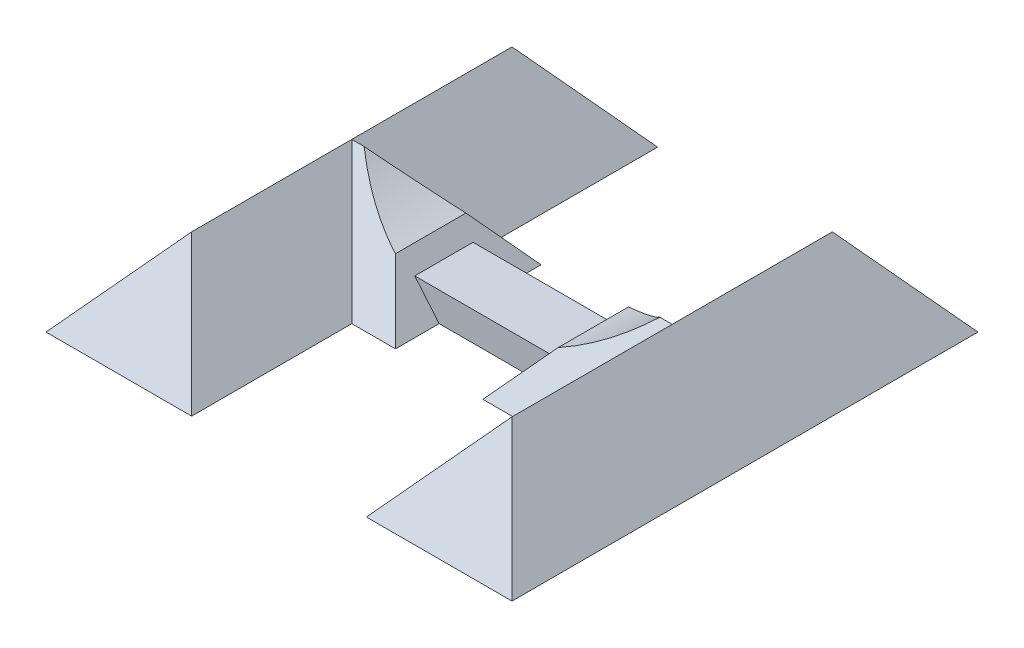
ISO-10303-21;
HEADER;
FILE_DESCRIPTION(('STEP AP214'),'2;1');
FILE_NAME('part.step','',(''),(''),'','','');
FILE_SCHEMA(('AUTOMOTIVE_DESIGN { 1 0 10303 214 1 1 1 1 }'));
ENDSEC;
DATA;
#1=APPLICATION_CONTEXT('core data for automotive mechanical design processes');
#2=APPLICATION_PROTOCOL_DEFINITION('international standard','automotive_design',2000,#1);
#3=PRODUCT_CONTEXT('',#1,'mechanical');
#4=PRODUCT('Part','Part','',(#3));
#5=PRODUCT_RELATED_PRODUCT_CATEGORY('part','',(#4));
#6=PRODUCT_DEFINITION_FORMATION('','',#4);
#7=PRODUCT_DEFINITION_CONTEXT('part definition',#1,'design');
#8=PRODUCT_DEFINITION('design','',#6,#7);
#9=PRODUCT_DEFINITION_SHAPE('','',#8);
#10=(LENGTH_UNIT() NAMED_UNIT(*) SI_UNIT(.MILLI.,.METRE.));
#11=(NAMED_UNIT(*) PLANE_ANGLE_UNIT() SI_UNIT($,.RADIAN.));
#12=(NAMED_UNIT(*) SI_UNIT($,.STERADIAN.) SOLID_ANGLE_UNIT());
#13=UNCERTAINTY_MEASURE_WITH_UNIT(LENGTH_MEASURE(1.E-05),#10,'distance_accuracy_value','');
#14=(GEOMETRIC_REPRESENTATION_CONTEXT(3) GLOBAL_UNCERTAINTY_ASSIGNED_CONTEXT((#13)) GLOBAL_UNIT_ASSIGNED_CONTEXT((#10,
#11,#12)) REPRESENTATION_CONTEXT('',''));
#15=CARTESIAN_POINT('',(0.,0.,0.));
#16=DIRECTION('',(0.,0.,1.));
#17=DIRECTION('',(1.,0.,0.));
#18=AXIS2_PLACEMENT_3D('',#15,#16,#17);
#19=CARTESIAN_POINT('',(0.,0.,0.));
#20=DIRECTION('',(-0.766044443118977,0.64278760968654,0.));
#21=DIRECTION('',(-0.64278760968654,-0.766044443118977,0.));
#22=AXIS2_PLACEMENT_3D('',#19,#20,#21);
#23=PLANE('',#22);
#24=DIRECTION('',(-0.540716203060937,-0.644400477571771,0.540716203060937));
#25=VECTOR('',#24,1.);
#26=CARTESIAN_POINT('',(0.,0.,0.));
#27=LINE('',#26,#25);
#28=CARTESIAN_POINT('',(1.29112833109021,1.53870682707692,-1.29112833109021));
#29=VERTEX_POINT('',#28);
#30=CARTESIAN_POINT('',(0.,0.,0.));
#31=VERTEX_POINT('',#30);
#32=EDGE_CURVE('E226',#29,#31,#27,.T.);
#33=ORIENTED_EDGE('',*,*,#32,.F.);
#34=DIRECTION('',(0.,0.,1.));
#35=VECTOR('',#34,1.);
#36=CARTESIAN_POINT('',(1.2911283310902,1.53870682707691,-8.75));
#37=LINE('',#36,#35);
#38=CARTESIAN_POINT('',(1.2911283310902,1.53870682707691,-3.7088716689098));
#39=VERTEX_POINT('',#38);
#40=EDGE_CURVE('E276',#29,#39,#37,.F.);
#41=ORIENTED_EDGE('',*,*,#40,.T.);
#42=DIRECTION('',(-0.540716203060938,-0.644400477571771,-0.540716203060937));
#43=VECTOR('',#42,1.);
#44=CARTESIAN_POINT('',(1.46187006126318,1.74218889741631,-3.53812993873682));
#45=LINE('',#44,#43);
#46=CARTESIAN_POINT('',(0.,0.,-5.));
#47=VERTEX_POINT('',#46);
#48=EDGE_CURVE('E225',#39,#47,#45,.T.);
#49=ORIENTED_EDGE('',*,*,#48,.T.);
#50=DIRECTION('',(0.,0.,1.));
#51=VECTOR('',#50,1.);
#52=CARTESIAN_POINT('',(0.,0.,0.));
#53=LINE('',#52,#51);
#54=CARTESIAN_POINT('',(0.,0.,-3.49999999999998));
#55=VERTEX_POINT('',#54);
#56=EDGE_CURVE('E204',#47,#55,#53,.T.);
#57=ORIENTED_EDGE('',*,*,#56,.T.);
#58=DIRECTION('',(-0.64278760968654,-0.766044443118977,0.));
#59=VECTOR('',#58,1.);
#60=CARTESIAN_POINT('',(0.,0.,-3.49999999999998));
#61=LINE('',#60,#59);
#62=CARTESIAN_POINT('',(0.839099631177282,1.,-3.49999999999998));
#63=VERTEX_POINT('',#62);
#64=EDGE_CURVE('E194',#55,#63,#61,.F.);
#65=ORIENTED_EDGE('',*,*,#64,.T.);
#66=DIRECTION('',(0.,0.,1.));
#67=VECTOR('',#66,1.);
#68=CARTESIAN_POINT('',(0.839099631177282,1.,0.));
#69=LINE('',#68,#67);
#70=CARTESIAN_POINT('',(0.839099631177282,1.,-1.49999999999998));
#71=VERTEX_POINT('',#70);
#72=EDGE_CURVE('E47',#71,#63,#69,.F.);
#73=ORIENTED_EDGE('',*,*,#72,.F.);
#74=DIRECTION('',(0.64278760968654,0.766044443118977,0.));
#75=VECTOR('',#74,1.);
#76=CARTESIAN_POINT('',(0.,0.,-1.49999999999998));
#77=LINE('',#76,#75);
#78=CARTESIAN_POINT('',(0.,0.,-1.49999999999998));
#79=VERTEX_POINT('',#78);
#80=EDGE_CURVE('E200',#71,#79,#77,.F.);
#81=ORIENTED_EDGE('',*,*,#80,.T.);
#82=EDGE_CURVE('E203',#79,#31,#53,.T.);
#83=ORIENTED_EDGE('',*,*,#82,.T.);
#84=EDGE_LOOP('',(#33,#41,#49,#57,#65,#73,#81,#83));
#85=FACE_BOUND('',#84,.T.);
#86=ADVANCED_FACE('F39',(#85),#23,.T.);
#87=CARTESIAN_POINT('',(0.,0.,0.));
#88=DIRECTION('',(0.,0.64278760968654,0.766044443118977));
#89=DIRECTION('',(0.,-0.766044443118977,0.64278760968654));
#90=AXIS2_PLACEMENT_3D('',#87,#88,#89);
#91=PLANE('',#90);
#92=DIRECTION('',(1.,0.,0.));
#93=VECTOR('',#92,1.);
#94=CARTESIAN_POINT('',(0.,2.97938398148551,-2.5));
#95=LINE('',#94,#93);
#96=CARTESIAN_POINT('',(3.57669171568663,2.97938398148552,-2.5));
#97=VERTEX_POINT('',#96);
#98=CARTESIAN_POINT('',(4.,2.97938398148552,-2.5));
#99=VERTEX_POINT('',#98);
#100=EDGE_CURVE('E249',#97,#99,#95,.T.);
#101=ORIENTED_EDGE('',*,*,#100,.F.);
#102=CARTESIAN_POINT('',(-1.5,8.5,-7.1323468650069));
#103=DIRECTION('',(0.,0.64278760968654,0.766044443118977));
#104=DIRECTION('',(0.,-0.766044443118977,0.64278760968654));
#105=AXIS2_PLACEMENT_3D('',#102,#103,#104);
#106=ELLIPSE('',#105,9.7905546699921,7.5);
#107=EDGE_CURVE('E54',#97,#29,#106,.F.);
#108=ORIENTED_EDGE('',*,*,#107,.T.);
#109=ORIENTED_EDGE('',*,*,#32,.T.);
#110=DIRECTION('',(1.,0.,0.));
#111=VECTOR('',#110,1.);
#112=CARTESIAN_POINT('',(0.,0.,0.));
#113=LINE('',#112,#111);
#114=CARTESIAN_POINT('',(1.5,0.,0.));
#115=VERTEX_POINT('',#114);
#116=EDGE_CURVE('E206',#31,#115,#113,.T.);
#117=ORIENTED_EDGE('',*,*,#116,.T.);
#118=DIRECTION('',(-0.540716203060937,-0.644400477571771,0.540716203060937));
#119=VECTOR('',#118,1.);
#120=CARTESIAN_POINT('',(1.06143898162104,-0.522656669224893,0.438561018378955));
#121=LINE('',#120,#119);
#122=EDGE_CURVE('E229',#99,#115,#121,.T.);
#123=ORIENTED_EDGE('',*,*,#122,.F.);
#124=EDGE_LOOP('',(#101,#108,#109,#117,#123));
#125=FACE_BOUND('',#124,.T.);
#126=ADVANCED_FACE('F41',(#125),#91,.T.);
#127=CARTESIAN_POINT('',(1.5,0.,0.));
#128=DIRECTION('',(-0.766044443118977,0.64278760968654,0.));
#129=DIRECTION('',(-0.64278760968654,-0.766044443118977,0.));
#130=AXIS2_PLACEMENT_3D('',#127,#128,#129);
#131=PLANE('',#130);
#132=DIRECTION('',(-0.540716203060937,-0.644400477571771,0.540716203060938));
#133=VECTOR('',#132,1.);
#134=CARTESIAN_POINT('',(2.96187006126318,1.74218889741631,4.03812993873682));
#135=LINE('',#134,#133);
#136=CARTESIAN_POINT('',(4.,2.97938398148552,3.));
#137=VERTEX_POINT('',#136);
#138=CARTESIAN_POINT('',(1.5,0.,5.5));
#139=VERTEX_POINT('',#138);
#140=EDGE_CURVE('E241',#137,#139,#135,.T.);
#141=ORIENTED_EDGE('',*,*,#140,.F.);
#142=DIRECTION('',(0.,0.,-1.));
#143=VECTOR('',#142,1.);
#144=CARTESIAN_POINT('',(4.,2.97938398148552,0.));
#145=LINE('',#144,#143);
#146=EDGE_CURVE('E228',#137,#99,#145,.T.);
#147=ORIENTED_EDGE('',*,*,#146,.T.);
#148=ORIENTED_EDGE('',*,*,#122,.T.);
#149=DIRECTION('',(0.,0.,1.));
#150=VECTOR('',#149,1.);
#151=CARTESIAN_POINT('',(1.5,0.,0.));
#152=LINE('',#151,#150);
#153=EDGE_CURVE('E209',#115,#139,#152,.T.);
#154=ORIENTED_EDGE('',*,*,#153,.T.);
#155=EDGE_LOOP('',(#141,#147,#148,#154));
#156=FACE_BOUND('',#155,.T.);
#157=ADVANCED_FACE('F357',(#156),#131,.T.);
#158=CARTESIAN_POINT('',(6.5,0.,5.5));
#159=DIRECTION('',(0.,0.64278760968654,0.766044443118977));
#160=DIRECTION('',(0.,-0.766044443118977,0.64278760968654));
#161=AXIS2_PLACEMENT_3D('',#158,#159,#160);
#162=PLANE('',#161);
#163=DIRECTION('',(1.,0.,0.));
#164=VECTOR('',#163,1.);
#165=CARTESIAN_POINT('',(6.5,0.,5.5));
#166=LINE('',#165,#164);
#167=CARTESIAN_POINT('',(6.5,0.,5.5));
#168=VERTEX_POINT('',#167);
#169=EDGE_CURVE('E212',#139,#168,#166,.T.);
#170=ORIENTED_EDGE('',*,*,#169,.T.);
#171=DIRECTION('',(0.540716203060938,-0.644400477571771,0.540716203060937));
#172=VECTOR('',#171,1.);
#173=CARTESIAN_POINT('',(1.82201580395781,5.5750044717322,0.822015803957811));
#174=LINE('',#173,#172);
#175=EDGE_CURVE('E238',#137,#168,#174,.T.);
#176=ORIENTED_EDGE('',*,*,#175,.F.);
#177=ORIENTED_EDGE('',*,*,#140,.T.);
#178=EDGE_LOOP('',(#170,#176,#177));
#179=FACE_BOUND('',#178,.T.);
#180=ADVANCED_FACE('F376',(#179),#162,.T.);
#181=CARTESIAN_POINT('',(6.5,0.,-10.5));
#182=DIRECTION('',(0.766044443118977,0.64278760968654,0.));
#183=DIRECTION('',(-0.64278760968654,0.766044443118977,0.));
#184=AXIS2_PLACEMENT_3D('',#181,#182,#183);
#185=PLANE('',#184);
#186=DIRECTION('',(0.540716203060937,-0.644400477571771,-0.540716203060937));
#187=VECTOR('',#186,1.);
#188=CARTESIAN_POINT('',(6.5,0.,-10.5));
#189=LINE('',#188,#187);
#190=CARTESIAN_POINT('',(4.,2.97938398148552,-8.));
#191=VERTEX_POINT('',#190);
#192=CARTESIAN_POINT('',(6.5,0.,-10.5));
#193=VERTEX_POINT('',#192);
#194=EDGE_CURVE('E236',#191,#193,#189,.T.);
#195=ORIENTED_EDGE('',*,*,#194,.F.);
#196=DIRECTION('',(0.,0.,1.));
#197=VECTOR('',#196,1.);
#198=CARTESIAN_POINT('',(4.,2.97938398148552,-10.5));
#199=LINE('',#198,#197);
#200=EDGE_CURVE('E246',#191,#99,#199,.T.);
#201=ORIENTED_EDGE('',*,*,#200,.T.);
#202=ORIENTED_EDGE('',*,*,#146,.F.);
#203=ORIENTED_EDGE('',*,*,#175,.T.);
#204=DIRECTION('',(0.,0.,-1.));
#205=VECTOR('',#204,1.);
#206=CARTESIAN_POINT('',(6.5,0.,-10.5));
#207=LINE('',#206,#205);
#208=EDGE_CURVE('E214',#168,#193,#207,.T.);
#209=ORIENTED_EDGE('',*,*,#208,.T.);
#210=EDGE_LOOP('',(#195,#201,#202,#203,#209));
#211=FACE_BOUND('',#210,.T.);
#212=ADVANCED_FACE('F372',(#211),#185,.T.);
#213=CARTESIAN_POINT('',(6.5,0.,-10.5));
#214=DIRECTION('',(0.,0.64278760968654,-0.766044443118977));
#215=DIRECTION('',(0.,0.766044443118977,0.64278760968654));
#216=AXIS2_PLACEMENT_3D('',#213,#214,#215);
#217=PLANE('',#216);
#218=DIRECTION('',(-1.,0.,0.));
#219=VECTOR('',#218,1.);
#220=CARTESIAN_POINT('',(6.5,0.,-10.5));
#221=LINE('',#220,#219);
#222=CARTESIAN_POINT('',(1.5,0.,-10.5));
#223=VERTEX_POINT('',#222);
#224=EDGE_CURVE('E217',#193,#223,#221,.T.);
#225=ORIENTED_EDGE('',*,*,#224,.T.);
#226=DIRECTION('',(-0.540716203060937,-0.64440047757177,-0.540716203060937));
#227=VECTOR('',#226,1.);
#228=CARTESIAN_POINT('',(1.5,0.,-10.5));
#229=LINE('',#228,#227);
#230=EDGE_CURVE('E233',#191,#223,#229,.T.);
#231=ORIENTED_EDGE('',*,*,#230,.F.);
#232=ORIENTED_EDGE('',*,*,#194,.T.);
#233=EDGE_LOOP('',(#225,#231,#232));
#234=FACE_BOUND('',#233,.T.);
#235=ADVANCED_FACE('F368',(#234),#217,.T.);
#236=CARTESIAN_POINT('',(1.5,0.,-10.5));
#237=DIRECTION('',(-0.766044443118977,0.64278760968654,0.));
#238=DIRECTION('',(-0.64278760968654,-0.766044443118977,0.));
#239=AXIS2_PLACEMENT_3D('',#236,#237,#238);
#240=PLANE('',#239);
#241=ORIENTED_EDGE('',*,*,#200,.F.);
#242=ORIENTED_EDGE('',*,*,#230,.T.);
#243=DIRECTION('',(0.,0.,1.));
#244=VECTOR('',#243,1.);
#245=CARTESIAN_POINT('',(1.5,0.,-10.5));
#246=LINE('',#245,#244);
#247=CARTESIAN_POINT('',(1.5,0.,-5.));
#248=VERTEX_POINT('',#247);
#249=EDGE_CURVE('E219',#223,#248,#246,.T.);
#250=ORIENTED_EDGE('',*,*,#249,.T.);
#251=DIRECTION('',(-0.540716203060938,-0.644400477571771,-0.540716203060937));
#252=VECTOR('',#251,1.);
#253=CARTESIAN_POINT('',(-0.108057067389504,-1.91640778715794,-6.6080570673895));
#254=LINE('',#253,#252);
#255=EDGE_CURVE('E231',#99,#248,#254,.T.);
#256=ORIENTED_EDGE('',*,*,#255,.F.);
#257=EDGE_LOOP('',(#241,#242,#250,#256));
#258=FACE_BOUND('',#257,.T.);
#259=ADVANCED_FACE('F364',(#258),#240,.T.);
#260=CARTESIAN_POINT('',(0.,0.,-5.));
#261=DIRECTION('',(0.,0.64278760968654,-0.766044443118977));
#262=DIRECTION('',(0.,0.766044443118977,0.64278760968654));
#263=AXIS2_PLACEMENT_3D('',#260,#261,#262);
#264=PLANE('',#263);
#265=ORIENTED_EDGE('',*,*,#48,.F.);
#266=CARTESIAN_POINT('',(-1.5,8.5,2.1323468650069));
#267=DIRECTION('',(0.,0.64278760968654,-0.766044443118977));
#268=DIRECTION('',(0.,0.766044443118977,0.64278760968654));
#269=AXIS2_PLACEMENT_3D('',#266,#267,#268);
#270=ELLIPSE('',#269,9.7905546699921,7.5);
#271=EDGE_CURVE('E281',#39,#97,#270,.F.);
#272=ORIENTED_EDGE('',*,*,#271,.T.);
#273=ORIENTED_EDGE('',*,*,#100,.T.);
#274=ORIENTED_EDGE('',*,*,#255,.T.);
#275=DIRECTION('',(-1.,0.,0.));
#276=VECTOR('',#275,1.);
#277=CARTESIAN_POINT('',(0.,0.,-5.));
#278=LINE('',#277,#276);
#279=EDGE_CURVE('E222',#248,#47,#278,.T.);
#280=ORIENTED_EDGE('',*,*,#279,.T.);
#281=EDGE_LOOP('',(#265,#272,#273,#274,#280));
#282=FACE_BOUND('',#281,.T.);
#283=ADVANCED_FACE('F361',(#282),#264,.T.);
#284=CARTESIAN_POINT('',(0.,0.,0.));
#285=DIRECTION('',(0.,-1.,0.));
#286=DIRECTION('',(0.,0.,-1.));
#287=AXIS2_PLACEMENT_3D('',#284,#285,#286);
#288=PLANE('',#287);
#289=ORIENTED_EDGE('',*,*,#82,.F.);
#290=DIRECTION('',(-1.,0.,0.));
#291=VECTOR('',#290,1.);
#292=CARTESIAN_POINT('',(-1.5,0.,-1.49999999999998));
#293=LINE('',#292,#291);
#294=CARTESIAN_POINT('',(-3.,0.,-1.49999999999998));
#295=VERTEX_POINT('',#294);
#296=EDGE_CURVE('E192',#79,#295,#293,.T.);
#297=ORIENTED_EDGE('',*,*,#296,.T.);
#298=DIRECTION('',(0.,0.,1.));
#299=VECTOR('',#298,1.);
#300=CARTESIAN_POINT('',(-3.,0.,0.));
#301=LINE('',#300,#299);
#302=CARTESIAN_POINT('',(-3.,0.,0.));
#303=VERTEX_POINT('',#302);
#304=EDGE_CURVE('E272',#295,#303,#301,.T.);
#305=ORIENTED_EDGE('',*,*,#304,.T.);
#306=DIRECTION('',(-1.,0.,0.));
#307=VECTOR('',#306,1.);
#308=CARTESIAN_POINT('',(-3.,0.,0.));
#309=LINE('',#308,#307);
#310=CARTESIAN_POINT('',(-4.5,0.,0.));
#311=VERTEX_POINT('',#310);
#312=EDGE_CURVE('E293',#303,#311,#309,.T.);
#313=ORIENTED_EDGE('',*,*,#312,.T.);
#314=DIRECTION('',(0.,0.,1.));
#315=VECTOR('',#314,1.);
#316=CARTESIAN_POINT('',(-4.5,0.,0.));
#317=LINE('',#316,#315);
#318=CARTESIAN_POINT('',(-4.5,0.,5.5));
#319=VERTEX_POINT('',#318);
#320=EDGE_CURVE('E295',#311,#319,#317,.T.);
#321=ORIENTED_EDGE('',*,*,#320,.T.);
#322=DIRECTION('',(-1.,0.,0.));
#323=VECTOR('',#322,1.);
#324=CARTESIAN_POINT('',(-9.5,0.,5.5));
#325=LINE('',#324,#323);
#326=CARTESIAN_POINT('',(-9.5,0.,5.5));
#327=VERTEX_POINT('',#326);
#328=EDGE_CURVE('E298',#319,#327,#325,.T.);
#329=ORIENTED_EDGE('',*,*,#328,.T.);
#330=DIRECTION('',(0.,0.,-1.));
#331=VECTOR('',#330,1.);
#332=CARTESIAN_POINT('',(-9.5,0.,-10.5));
#333=LINE('',#332,#331);
#334=CARTESIAN_POINT('',(-9.5,0.,-10.5));
#335=VERTEX_POINT('',#334);
#336=EDGE_CURVE('E301',#327,#335,#333,.T.);
#337=ORIENTED_EDGE('',*,*,#336,.T.);
#338=DIRECTION('',(1.,0.,0.));
#339=VECTOR('',#338,1.);
#340=CARTESIAN_POINT('',(-9.5,0.,-10.5));
#341=LINE('',#340,#339);
#342=CARTESIAN_POINT('',(-4.5,0.,-10.5));
#343=VERTEX_POINT('',#342);
#344=EDGE_CURVE('E304',#335,#343,#341,.T.);
#345=ORIENTED_EDGE('',*,*,#344,.T.);
#346=DIRECTION('',(0.,0.,1.));
#347=VECTOR('',#346,1.);
#348=CARTESIAN_POINT('',(-4.5,0.,-10.5));
#349=LINE('',#348,#347);
#350=CARTESIAN_POINT('',(-4.5,0.,-5.));
#351=VERTEX_POINT('',#350);
#352=EDGE_CURVE('E307',#343,#351,#349,.T.);
#353=ORIENTED_EDGE('',*,*,#352,.T.);
#354=DIRECTION('',(1.,0.,0.));
#355=VECTOR('',#354,1.);
#356=CARTESIAN_POINT('',(-3.,0.,-5.));
#357=LINE('',#356,#355);
#358=CARTESIAN_POINT('',(-3.,0.,-5.));
#359=VERTEX_POINT('',#358);
#360=EDGE_CURVE('E310',#351,#359,#357,.T.);
#361=ORIENTED_EDGE('',*,*,#360,.T.);
#362=CARTESIAN_POINT('',(-3.,0.,-3.49999999999998));
#363=VERTEX_POINT('',#362);
#364=EDGE_CURVE('E290',#359,#363,#301,.T.);
#365=ORIENTED_EDGE('',*,*,#364,.T.);
#366=DIRECTION('',(1.,0.,0.));
#367=VECTOR('',#366,1.);
#368=CARTESIAN_POINT('',(-1.5,0.,-3.49999999999998));
#369=LINE('',#368,#367);
#370=EDGE_CURVE('E183',#363,#55,#369,.T.);
#371=ORIENTED_EDGE('',*,*,#370,.T.);
#372=ORIENTED_EDGE('',*,*,#56,.F.);
#373=ORIENTED_EDGE('',*,*,#279,.F.);
#374=ORIENTED_EDGE('',*,*,#249,.F.);
#375=ORIENTED_EDGE('',*,*,#224,.F.);
#376=ORIENTED_EDGE('',*,*,#208,.F.);
#377=ORIENTED_EDGE('',*,*,#169,.F.);
#378=ORIENTED_EDGE('',*,*,#153,.F.);
#379=ORIENTED_EDGE('',*,*,#116,.F.);
#380=EDGE_LOOP('',(#289,#297,#305,#313,#321,#329,#337,#345,#353,#361,#365,#371,#372,#373,#374,
#375,#376,#377,#378,#379));
#381=FACE_BOUND('',#380,.T.);
#382=ADVANCED_FACE('F270',(#381),#288,.T.);
#383=CARTESIAN_POINT('',(0.,1.,0.));
#384=DIRECTION('',(0.,-1.,0.));
#385=DIRECTION('',(0.,0.,-1.));
#386=AXIS2_PLACEMENT_3D('',#383,#384,#385);
#387=PLANE('',#386);
#388=ORIENTED_EDGE('',*,*,#72,.T.);
#389=DIRECTION('',(1.,0.,0.));
#390=VECTOR('',#389,1.);
#391=CARTESIAN_POINT('',(-1.5,1.,-3.49999999999998));
#392=LINE('',#391,#390);
#393=CARTESIAN_POINT('',(-3.83909963117728,1.,-3.49999999999998));
#394=VERTEX_POINT('',#393);
#395=EDGE_CURVE('E189',#394,#63,#392,.T.);
#396=ORIENTED_EDGE('',*,*,#395,.F.);
#397=DIRECTION('',(0.,0.,1.));
#398=VECTOR('',#397,1.);
#399=CARTESIAN_POINT('',(-3.83909963117728,1.,0.));
#400=LINE('',#399,#398);
#401=CARTESIAN_POINT('',(-3.83909963117728,1.,-1.49999999999998));
#402=VERTEX_POINT('',#401);
#403=EDGE_CURVE('E179',#402,#394,#400,.F.);
#404=ORIENTED_EDGE('',*,*,#403,.F.);
#405=DIRECTION('',(-1.,0.,0.));
#406=VECTOR('',#405,1.);
#407=CARTESIAN_POINT('',(-1.5,1.,-1.49999999999998));
#408=LINE('',#407,#406);
#409=EDGE_CURVE('E191',#71,#402,#408,.T.);
#410=ORIENTED_EDGE('',*,*,#409,.F.);
#411=EDGE_LOOP('',(#388,#396,#404,#410));
#412=FACE_BOUND('',#411,.T.);
#413=ADVANCED_FACE('F253',(#412),#387,.F.);
#414=CARTESIAN_POINT('',(-1.5,1.,-1.49999999999998));
#415=DIRECTION('',(0.,0.,1.));
#416=DIRECTION('',(1.,0.,0.));
#417=AXIS2_PLACEMENT_3D('',#414,#415,#416);
#418=PLANE('',#417);
#419=ORIENTED_EDGE('',*,*,#80,.F.);
#420=ORIENTED_EDGE('',*,*,#409,.T.);
#421=DIRECTION('',(-0.64278760968654,0.766044443118977,0.));
#422=VECTOR('',#421,1.);
#423=CARTESIAN_POINT('',(-3.,0.,-1.49999999999998));
#424=LINE('',#423,#422);
#425=EDGE_CURVE('E266',#402,#295,#424,.F.);
#426=ORIENTED_EDGE('',*,*,#425,.T.);
#427=ORIENTED_EDGE('',*,*,#296,.F.);
#428=EDGE_LOOP('',(#419,#420,#426,#427));
#429=FACE_BOUND('',#428,.T.);
#430=ADVANCED_FACE('F263',(#429),#418,.T.);
#431=CARTESIAN_POINT('',(-1.5,1.,-3.49999999999998));
#432=DIRECTION('',(0.,0.,-1.));
#433=DIRECTION('',(-1.,0.,0.));
#434=AXIS2_PLACEMENT_3D('',#431,#432,#433);
#435=PLANE('',#434);
#436=ORIENTED_EDGE('',*,*,#64,.F.);
#437=ORIENTED_EDGE('',*,*,#370,.F.);
#438=DIRECTION('',(0.64278760968654,-0.766044443118977,0.));
#439=VECTOR('',#438,1.);
#440=CARTESIAN_POINT('',(-3.,0.,-3.49999999999998));
#441=LINE('',#440,#439);
#442=EDGE_CURVE('E283',#363,#394,#441,.F.);
#443=ORIENTED_EDGE('',*,*,#442,.T.);
#444=ORIENTED_EDGE('',*,*,#395,.T.);
#445=EDGE_LOOP('',(#436,#437,#443,#444));
#446=FACE_BOUND('',#445,.T.);
#447=ADVANCED_FACE('F405',(#446),#435,.T.);
#448=CARTESIAN_POINT('',(-3.,0.,0.));
#449=DIRECTION('',(0.766044443118977,0.64278760968654,0.));
#450=DIRECTION('',(0.64278760968654,-0.766044443118977,0.));
#451=AXIS2_PLACEMENT_3D('',#448,#449,#450);
#452=PLANE('',#451);
#453=DIRECTION('',(0.540716203060938,-0.644400477571771,-0.540716203060937));
#454=VECTOR('',#453,1.);
#455=CARTESIAN_POINT('',(-4.46187006126318,1.74218889741631,-3.53812993873682));
#456=LINE('',#455,#454);
#457=CARTESIAN_POINT('',(-4.2911283310902,1.53870682707691,-3.7088716689098));
#458=VERTEX_POINT('',#457);
#459=EDGE_CURVE('E313',#458,#359,#456,.T.);
#460=ORIENTED_EDGE('',*,*,#459,.F.);
#461=DIRECTION('',(0.,0.,1.));
#462=VECTOR('',#461,1.);
#463=CARTESIAN_POINT('',(-4.29112833109021,1.53870682707691,-8.75));
#464=LINE('',#463,#462);
#465=CARTESIAN_POINT('',(-4.29112833109021,1.53870682707692,-1.29112833109021));
#466=VERTEX_POINT('',#465);
#467=EDGE_CURVE('E62',#458,#466,#464,.T.);
#468=ORIENTED_EDGE('',*,*,#467,.T.);
#469=DIRECTION('',(0.540716203060937,-0.644400477571771,0.540716203060937));
#470=VECTOR('',#469,1.);
#471=CARTESIAN_POINT('',(-3.,0.,0.));
#472=LINE('',#471,#470);
#473=EDGE_CURVE('E173',#466,#303,#472,.T.);
#474=ORIENTED_EDGE('',*,*,#473,.T.);
#475=ORIENTED_EDGE('',*,*,#304,.F.);
#476=ORIENTED_EDGE('',*,*,#425,.F.);
#477=ORIENTED_EDGE('',*,*,#403,.T.);
#478=ORIENTED_EDGE('',*,*,#442,.F.);
#479=ORIENTED_EDGE('',*,*,#364,.F.);
#480=EDGE_LOOP('',(#460,#468,#474,#475,#476,#477,#478,#479));
#481=FACE_BOUND('',#480,.T.);
#482=ADVANCED_FACE('F402',(#481),#452,.T.);
#483=CARTESIAN_POINT('',(-3.,0.,0.));
#484=DIRECTION('',(0.,0.64278760968654,0.766044443118977));
#485=DIRECTION('',(0.,-0.766044443118977,0.64278760968654));
#486=AXIS2_PLACEMENT_3D('',#483,#484,#485);
#487=PLANE('',#486);
#488=ORIENTED_EDGE('',*,*,#473,.F.);
#489=CARTESIAN_POINT('',(-1.5,8.5,-7.1323468650069));
#490=DIRECTION('',(0.,0.64278760968654,0.766044443118977));
#491=DIRECTION('',(0.,-0.766044443118977,0.64278760968654));
#492=AXIS2_PLACEMENT_3D('',#489,#490,#491);
#493=ELLIPSE('',#492,9.7905546699921,7.5);
#494=CARTESIAN_POINT('',(-6.57669171568663,2.97938398148552,-2.5));
#495=VERTEX_POINT('',#494);
#496=EDGE_CURVE('E162',#466,#495,#493,.F.);
#497=ORIENTED_EDGE('',*,*,#496,.T.);
#498=DIRECTION('',(-1.,0.,0.));
#499=VECTOR('',#498,1.);
#500=CARTESIAN_POINT('',(-3.,2.97938398148551,-2.5));
#501=LINE('',#500,#499);
#502=CARTESIAN_POINT('',(-7.,2.97938398148552,-2.5));
#503=VERTEX_POINT('',#502);
#504=EDGE_CURVE('E170',#495,#503,#501,.T.);
#505=ORIENTED_EDGE('',*,*,#504,.T.);
#506=DIRECTION('',(0.540716203060937,-0.644400477571771,0.540716203060937));
#507=VECTOR('',#506,1.);
#508=CARTESIAN_POINT('',(-4.06143898162104,-0.522656669224893,0.438561018378955));
#509=LINE('',#508,#507);
#510=EDGE_CURVE('E315',#503,#311,#509,.T.);
#511=ORIENTED_EDGE('',*,*,#510,.T.);
#512=ORIENTED_EDGE('',*,*,#312,.F.);
#513=EDGE_LOOP('',(#488,#497,#505,#511,#512));
#514=FACE_BOUND('',#513,.T.);
#515=ADVANCED_FACE('F168',(#514),#487,.T.);
#516=CARTESIAN_POINT('',(-4.5,0.,0.));
#517=DIRECTION('',(0.766044443118977,0.64278760968654,0.));
#518=DIRECTION('',(0.64278760968654,-0.766044443118977,0.));
#519=AXIS2_PLACEMENT_3D('',#516,#517,#518);
#520=PLANE('',#519);
#521=DIRECTION('',(0.540716203060937,-0.644400477571771,0.540716203060938));
#522=VECTOR('',#521,1.);
#523=CARTESIAN_POINT('',(-5.96187006126318,1.74218889741631,4.03812993873682));
#524=LINE('',#523,#522);
#525=CARTESIAN_POINT('',(-7.,2.97938398148552,3.));
#526=VERTEX_POINT('',#525);
#527=EDGE_CURVE('E327',#526,#319,#524,.T.);
#528=ORIENTED_EDGE('',*,*,#527,.T.);
#529=ORIENTED_EDGE('',*,*,#320,.F.);
#530=ORIENTED_EDGE('',*,*,#510,.F.);
#531=DIRECTION('',(0.,0.,-1.));
#532=VECTOR('',#531,1.);
#533=CARTESIAN_POINT('',(-7.,2.97938398148552,0.));
#534=LINE('',#533,#532);
#535=EDGE_CURVE('E185',#526,#503,#534,.T.);
#536=ORIENTED_EDGE('',*,*,#535,.F.);
#537=EDGE_LOOP('',(#528,#529,#530,#536));
#538=FACE_BOUND('',#537,.T.);
#539=ADVANCED_FACE('F339',(#538),#520,.T.);
#540=CARTESIAN_POINT('',(-9.5,0.,5.5));
#541=DIRECTION('',(0.,0.64278760968654,0.766044443118977));
#542=DIRECTION('',(0.,-0.766044443118977,0.64278760968654));
#543=AXIS2_PLACEMENT_3D('',#540,#541,#542);
#544=PLANE('',#543);
#545=ORIENTED_EDGE('',*,*,#328,.F.);
#546=ORIENTED_EDGE('',*,*,#527,.F.);
#547=DIRECTION('',(-0.540716203060938,-0.644400477571771,0.540716203060937));
#548=VECTOR('',#547,1.);
#549=CARTESIAN_POINT('',(-4.82201580395781,5.5750044717322,0.822015803957811));
#550=LINE('',#549,#548);
#551=EDGE_CURVE('E324',#526,#327,#550,.T.);
#552=ORIENTED_EDGE('',*,*,#551,.T.);
#553=EDGE_LOOP('',(#545,#546,#552));
#554=FACE_BOUND('',#553,.T.);
#555=ADVANCED_FACE('F341',(#554),#544,.T.);
#556=CARTESIAN_POINT('',(-9.5,0.,-10.5));
#557=DIRECTION('',(-0.766044443118977,0.64278760968654,0.));
#558=DIRECTION('',(0.64278760968654,0.766044443118977,0.));
#559=AXIS2_PLACEMENT_3D('',#556,#557,#558);
#560=PLANE('',#559);
#561=DIRECTION('',(-0.540716203060937,-0.644400477571771,-0.540716203060937));
#562=VECTOR('',#561,1.);
#563=CARTESIAN_POINT('',(-9.5,0.,-10.5));
#564=LINE('',#563,#562);
#565=CARTESIAN_POINT('',(-7.,2.97938398148552,-8.));
#566=VERTEX_POINT('',#565);
#567=EDGE_CURVE('E321',#566,#335,#564,.T.);
#568=ORIENTED_EDGE('',*,*,#567,.T.);
#569=ORIENTED_EDGE('',*,*,#336,.F.);
#570=ORIENTED_EDGE('',*,*,#551,.F.);
#571=ORIENTED_EDGE('',*,*,#535,.T.);
#572=DIRECTION('',(0.,0.,1.));
#573=VECTOR('',#572,1.);
#574=CARTESIAN_POINT('',(-7.,2.97938398148552,-10.5));
#575=LINE('',#574,#573);
#576=EDGE_CURVE('E180',#566,#503,#575,.T.);
#577=ORIENTED_EDGE('',*,*,#576,.F.);
#578=EDGE_LOOP('',(#568,#569,#570,#571,#577));
#579=FACE_BOUND('',#578,.T.);
#580=ADVANCED_FACE('F335',(#579),#560,.T.);
#581=CARTESIAN_POINT('',(-9.5,0.,-10.5));
#582=DIRECTION('',(0.,0.64278760968654,-0.766044443118977));
#583=DIRECTION('',(0.,0.766044443118977,0.64278760968654));
#584=AXIS2_PLACEMENT_3D('',#581,#582,#583);
#585=PLANE('',#584);
#586=ORIENTED_EDGE('',*,*,#344,.F.);
#587=ORIENTED_EDGE('',*,*,#567,.F.);
#588=DIRECTION('',(0.540716203060937,-0.64440047757177,-0.540716203060937));
#589=VECTOR('',#588,1.);
#590=CARTESIAN_POINT('',(-4.5,0.,-10.5));
#591=LINE('',#590,#589);
#592=EDGE_CURVE('E318',#566,#343,#591,.T.);
#593=ORIENTED_EDGE('',*,*,#592,.T.);
#594=EDGE_LOOP('',(#586,#587,#593));
#595=FACE_BOUND('',#594,.T.);
#596=ADVANCED_FACE('F348',(#595),#585,.T.);
#597=CARTESIAN_POINT('',(-4.5,0.,-10.5));
#598=DIRECTION('',(0.766044443118977,0.64278760968654,0.));
#599=DIRECTION('',(0.64278760968654,-0.766044443118977,0.));
#600=AXIS2_PLACEMENT_3D('',#597,#598,#599);
#601=PLANE('',#600);
#602=ORIENTED_EDGE('',*,*,#576,.T.);
#603=DIRECTION('',(0.540716203060938,-0.644400477571771,-0.540716203060937));
#604=VECTOR('',#603,1.);
#605=CARTESIAN_POINT('',(-2.8919429326105,-1.91640778715794,-6.6080570673895));
#606=LINE('',#605,#604);
#607=EDGE_CURVE('E177',#503,#351,#606,.T.);
#608=ORIENTED_EDGE('',*,*,#607,.T.);
#609=ORIENTED_EDGE('',*,*,#352,.F.);
#610=ORIENTED_EDGE('',*,*,#592,.F.);
#611=EDGE_LOOP('',(#602,#608,#609,#610));
#612=FACE_BOUND('',#611,.T.);
#613=ADVANCED_FACE('F409',(#612),#601,.T.);
#614=CARTESIAN_POINT('',(-3.,0.,-5.));
#615=DIRECTION('',(0.,0.64278760968654,-0.766044443118977));
#616=DIRECTION('',(0.,0.766044443118977,0.64278760968654));
#617=AXIS2_PLACEMENT_3D('',#614,#615,#616);
#618=PLANE('',#617);
#619=ORIENTED_EDGE('',*,*,#504,.F.);
#620=CARTESIAN_POINT('',(-1.5,8.5,2.1323468650069));
#621=DIRECTION('',(0.,0.64278760968654,-0.766044443118977));
#622=DIRECTION('',(0.,0.766044443118977,0.64278760968654));
#623=AXIS2_PLACEMENT_3D('',#620,#621,#622);
#624=ELLIPSE('',#623,9.7905546699921,7.5);
#625=EDGE_CURVE('E11',#495,#458,#624,.F.);
#626=ORIENTED_EDGE('',*,*,#625,.T.);
#627=ORIENTED_EDGE('',*,*,#459,.T.);
#628=ORIENTED_EDGE('',*,*,#360,.F.);
#629=ORIENTED_EDGE('',*,*,#607,.F.);
#630=EDGE_LOOP('',(#619,#626,#627,#628,#629));
#631=FACE_BOUND('',#630,.T.);
#632=ADVANCED_FACE('F175',(#631),#618,.T.);
#633=CARTESIAN_POINT('',(-1.5,8.5,-8.75));
#634=DIRECTION('',(0.,0.,1.));
#635=DIRECTION('',(1.,0.,0.));
#636=AXIS2_PLACEMENT_3D('',#633,#634,#635);
#637=CYLINDRICAL_SURFACE('',#636,7.5);
#638=ORIENTED_EDGE('',*,*,#625,.F.);
#639=ORIENTED_EDGE('',*,*,#496,.F.);
#640=ORIENTED_EDGE('',*,*,#467,.F.);
#641=EDGE_LOOP('',(#638,#639,#640));
#642=FACE_BOUND('',#641,.T.);
#643=ADVANCED_FACE('F161',(#642),#637,.F.);
#644=ORIENTED_EDGE('',*,*,#107,.F.);
#645=ORIENTED_EDGE('',*,*,#271,.F.);
#646=ORIENTED_EDGE('',*,*,#40,.F.);
#647=EDGE_LOOP('',(#644,#645,#646));
#648=FACE_BOUND('',#647,.T.);
#649=ADVANCED_FACE('F395',(#648),#637,.F.);
#650=CLOSED_SHELL('',(#86,#126,#157,#180,#212,#235,#259,#283,#382,#413,#430,#447,#482,#515,#539,
#555,#580,#596,#613,#632,#643,#649));
#651=MANIFOLD_SOLID_BREP('B2',#650);
#652=ADVANCED_BREP_SHAPE_REPRESENTATION('',(#18,#651),#14);
#653=SHAPE_DEFINITION_REPRESENTATION(#9,#652);
ENDSEC;
END-ISO-10303-21;
